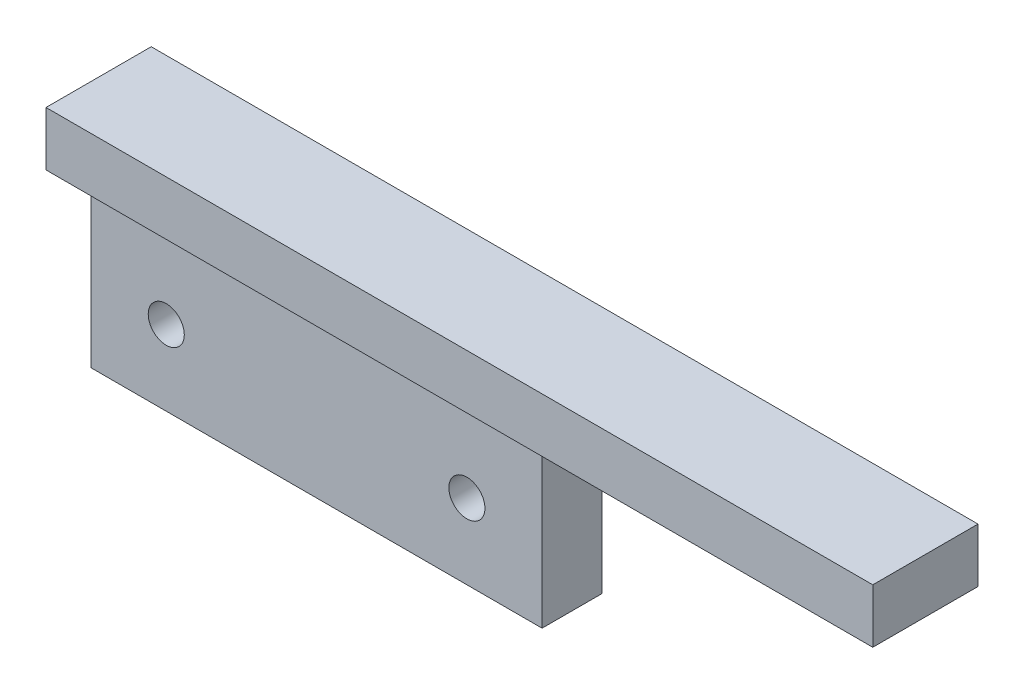
ISO-10303-21;
HEADER;
FILE_DESCRIPTION(('STEP AP214'),'2;1');
FILE_NAME('part.step','',(''),(''),'','','');
FILE_SCHEMA(('AUTOMOTIVE_DESIGN { 1 0 10303 214 1 1 1 1 }'));
ENDSEC;
DATA;
#1=APPLICATION_CONTEXT('core data for automotive mechanical design processes');
#2=APPLICATION_PROTOCOL_DEFINITION('international standard','automotive_design',2000,#1);
#3=PRODUCT_CONTEXT('',#1,'mechanical');
#4=PRODUCT('Part','Part','',(#3));
#5=PRODUCT_RELATED_PRODUCT_CATEGORY('part','',(#4));
#6=PRODUCT_DEFINITION_FORMATION('','',#4);
#7=PRODUCT_DEFINITION_CONTEXT('part definition',#1,'design');
#8=PRODUCT_DEFINITION('design','',#6,#7);
#9=PRODUCT_DEFINITION_SHAPE('','',#8);
#10=(LENGTH_UNIT() NAMED_UNIT(*) SI_UNIT(.MILLI.,.METRE.));
#11=(NAMED_UNIT(*) PLANE_ANGLE_UNIT() SI_UNIT($,.RADIAN.));
#12=(NAMED_UNIT(*) SI_UNIT($,.STERADIAN.) SOLID_ANGLE_UNIT());
#13=UNCERTAINTY_MEASURE_WITH_UNIT(LENGTH_MEASURE(1.E-05),#10,'distance_accuracy_value','');
#14=(GEOMETRIC_REPRESENTATION_CONTEXT(3) GLOBAL_UNCERTAINTY_ASSIGNED_CONTEXT((#13)) GLOBAL_UNIT_ASSIGNED_CONTEXT((#10,
#11,#12)) REPRESENTATION_CONTEXT('',''));
#15=CARTESIAN_POINT('',(0.,0.,0.));
#16=DIRECTION('',(0.,0.,1.));
#17=DIRECTION('',(1.,0.,0.));
#18=AXIS2_PLACEMENT_3D('',#15,#16,#17);
#19=CARTESIAN_POINT('',(30.,12.5,8.));
#20=DIRECTION('',(-1.,0.,0.));
#21=DIRECTION('',(0.,0.,1.));
#22=AXIS2_PLACEMENT_3D('',#19,#20,#21);
#23=PLANE('',#22);
#24=DIRECTION('',(0.,1.,0.));
#25=VECTOR('',#24,1.);
#26=CARTESIAN_POINT('',(30.,12.5,0.));
#27=LINE('',#26,#25);
#28=CARTESIAN_POINT('',(30.,-12.5,0.));
#29=VERTEX_POINT('',#28);
#30=CARTESIAN_POINT('',(30.,13.3,0.));
#31=VERTEX_POINT('',#30);
#32=EDGE_CURVE('E60',#29,#31,#27,.T.);
#33=ORIENTED_EDGE('',*,*,#32,.T.);
#34=DIRECTION('',(0.,0.,1.));
#35=VECTOR('',#34,1.);
#36=CARTESIAN_POINT('',(30.,13.3,0.));
#37=LINE('',#36,#35);
#38=CARTESIAN_POINT('',(30.,13.3,8.));
#39=VERTEX_POINT('',#38);
#40=EDGE_CURVE('E187',#31,#39,#37,.T.);
#41=ORIENTED_EDGE('',*,*,#40,.T.);
#42=DIRECTION('',(0.,1.,0.));
#43=VECTOR('',#42,1.);
#44=CARTESIAN_POINT('',(30.,12.5,8.));
#45=LINE('',#44,#43);
#46=CARTESIAN_POINT('',(30.,-12.5,8.));
#47=VERTEX_POINT('',#46);
#48=EDGE_CURVE('E88',#47,#39,#45,.T.);
#49=ORIENTED_EDGE('',*,*,#48,.F.);
#50=DIRECTION('',(0.,0.,-1.));
#51=VECTOR('',#50,1.);
#52=CARTESIAN_POINT('',(30.,-12.5,8.));
#53=LINE('',#52,#51);
#54=EDGE_CURVE('E52',#47,#29,#53,.T.);
#55=ORIENTED_EDGE('',*,*,#54,.T.);
#56=EDGE_LOOP('',(#33,#41,#49,#55));
#57=FACE_BOUND('',#56,.T.);
#58=ADVANCED_FACE('F43',(#57),#23,.F.);
#59=CARTESIAN_POINT('',(-30.,12.5,8.));
#60=DIRECTION('',(1.,0.,0.));
#61=DIRECTION('',(0.,0.,-1.));
#62=AXIS2_PLACEMENT_3D('',#59,#60,#61);
#63=PLANE('',#62);
#64=DIRECTION('',(0.,-1.,0.));
#65=VECTOR('',#64,1.);
#66=CARTESIAN_POINT('',(-30.,12.5,8.));
#67=LINE('',#66,#65);
#68=CARTESIAN_POINT('',(-30.,13.3,8.));
#69=VERTEX_POINT('',#68);
#70=CARTESIAN_POINT('',(-30.,-12.5,8.));
#71=VERTEX_POINT('',#70);
#72=EDGE_CURVE('E151',#69,#71,#67,.T.);
#73=ORIENTED_EDGE('',*,*,#72,.F.);
#74=DIRECTION('',(0.,0.,1.));
#75=VECTOR('',#74,1.);
#76=CARTESIAN_POINT('',(-30.,13.3,8.));
#77=LINE('',#76,#75);
#78=CARTESIAN_POINT('',(-30.,13.3,14.));
#79=VERTEX_POINT('',#78);
#80=EDGE_CURVE('E112',#69,#79,#77,.T.);
#81=ORIENTED_EDGE('',*,*,#80,.T.);
#82=DIRECTION('',(0.,-1.,0.));
#83=VECTOR('',#82,1.);
#84=CARTESIAN_POINT('',(-30.,12.5,14.));
#85=LINE('',#84,#83);
#86=CARTESIAN_POINT('',(-30.,20.5,14.));
#87=VERTEX_POINT('',#86);
#88=EDGE_CURVE('E143',#87,#79,#85,.T.);
#89=ORIENTED_EDGE('',*,*,#88,.F.);
#90=DIRECTION('',(0.,0.,-1.));
#91=VECTOR('',#90,1.);
#92=CARTESIAN_POINT('',(-30.,20.5,14.));
#93=LINE('',#92,#91);
#94=CARTESIAN_POINT('',(-30.,20.5,0.));
#95=VERTEX_POINT('',#94);
#96=EDGE_CURVE('E99',#87,#95,#93,.T.);
#97=ORIENTED_EDGE('',*,*,#96,.T.);
#98=DIRECTION('',(0.,-1.,0.));
#99=VECTOR('',#98,1.);
#100=CARTESIAN_POINT('',(-30.,12.5,0.));
#101=LINE('',#100,#99);
#102=CARTESIAN_POINT('',(-30.,-12.5,0.));
#103=VERTEX_POINT('',#102);
#104=EDGE_CURVE('E89',#95,#103,#101,.T.);
#105=ORIENTED_EDGE('',*,*,#104,.T.);
#106=DIRECTION('',(0.,0.,-1.));
#107=VECTOR('',#106,1.);
#108=CARTESIAN_POINT('',(-30.,-12.5,8.));
#109=LINE('',#108,#107);
#110=EDGE_CURVE('E11',#71,#103,#109,.T.);
#111=ORIENTED_EDGE('',*,*,#110,.F.);
#112=EDGE_LOOP('',(#73,#81,#89,#97,#105,#111));
#113=FACE_BOUND('',#112,.T.);
#114=ADVANCED_FACE('F160',(#113),#63,.F.);
#115=CARTESIAN_POINT('',(-30.,-12.5,8.));
#116=DIRECTION('',(0.,1.,0.));
#117=DIRECTION('',(0.,0.,1.));
#118=AXIS2_PLACEMENT_3D('',#115,#116,#117);
#119=PLANE('',#118);
#120=DIRECTION('',(1.,0.,0.));
#121=VECTOR('',#120,1.);
#122=CARTESIAN_POINT('',(-30.,-12.5,0.));
#123=LINE('',#122,#121);
#124=EDGE_CURVE('E81',#103,#29,#123,.T.);
#125=ORIENTED_EDGE('',*,*,#124,.T.);
#126=ORIENTED_EDGE('',*,*,#54,.F.);
#127=DIRECTION('',(1.,0.,0.));
#128=VECTOR('',#127,1.);
#129=CARTESIAN_POINT('',(-30.,-12.5,8.));
#130=LINE('',#129,#128);
#131=EDGE_CURVE('E69',#71,#47,#130,.T.);
#132=ORIENTED_EDGE('',*,*,#131,.F.);
#133=ORIENTED_EDGE('',*,*,#110,.T.);
#134=EDGE_LOOP('',(#125,#126,#132,#133));
#135=FACE_BOUND('',#134,.T.);
#136=ADVANCED_FACE('F82',(#135),#119,.F.);
#137=CARTESIAN_POINT('',(0.,0.,8.));
#138=DIRECTION('',(0.,0.,1.));
#139=DIRECTION('',(1.,0.,0.));
#140=AXIS2_PLACEMENT_3D('',#137,#138,#139);
#141=PLANE('',#140);
#142=CARTESIAN_POINT('',(20.,-2.5,8.));
#143=DIRECTION('',(0.,0.,1.));
#144=DIRECTION('',(1.,0.,0.));
#145=AXIS2_PLACEMENT_3D('',#142,#143,#144);
#146=CIRCLE('',#145,2.4);
#147=CARTESIAN_POINT('',(22.4,-2.5,8.));
#148=VERTEX_POINT('',#147);
#149=EDGE_CURVE('E46',#148,#148,#146,.T.);
#150=ORIENTED_EDGE('',*,*,#149,.F.);
#151=EDGE_LOOP('',(#150));
#152=FACE_BOUND('',#151,.T.);
#153=CARTESIAN_POINT('',(-20.,-2.5,8.));
#154=DIRECTION('',(0.,0.,1.));
#155=DIRECTION('',(1.,0.,0.));
#156=AXIS2_PLACEMENT_3D('',#153,#154,#155);
#157=CIRCLE('',#156,2.4);
#158=CARTESIAN_POINT('',(-17.6,-2.5,8.));
#159=VERTEX_POINT('',#158);
#160=EDGE_CURVE('E109',#159,#159,#157,.T.);
#161=ORIENTED_EDGE('',*,*,#160,.F.);
#162=EDGE_LOOP('',(#161));
#163=FACE_BOUND('',#162,.T.);
#164=ORIENTED_EDGE('',*,*,#48,.T.);
#165=DIRECTION('',(1.,0.,0.));
#166=VECTOR('',#165,1.);
#167=CARTESIAN_POINT('',(-30.,13.3,8.));
#168=LINE('',#167,#166);
#169=EDGE_CURVE('E119',#69,#39,#168,.T.);
#170=ORIENTED_EDGE('',*,*,#169,.F.);
#171=ORIENTED_EDGE('',*,*,#72,.T.);
#172=ORIENTED_EDGE('',*,*,#131,.T.);
#173=EDGE_LOOP('',(#164,#170,#171,#172));
#174=FACE_BOUND('',#173,.T.);
#175=ADVANCED_FACE('F156',(#152,#163,#174),#141,.T.);
#176=CARTESIAN_POINT('',(0.,0.,0.));
#177=DIRECTION('',(0.,0.,1.));
#178=DIRECTION('',(1.,0.,0.));
#179=AXIS2_PLACEMENT_3D('',#176,#177,#178);
#180=PLANE('',#179);
#181=CARTESIAN_POINT('',(20.,-2.5,0.));
#182=DIRECTION('',(0.,0.,-1.));
#183=DIRECTION('',(-1.,0.,0.));
#184=AXIS2_PLACEMENT_3D('',#181,#182,#183);
#185=CIRCLE('',#184,3.99999999999999);
#186=CARTESIAN_POINT('',(16.,-2.5,0.));
#187=VERTEX_POINT('',#186);
#188=EDGE_CURVE('E189',#187,#187,#185,.T.);
#189=ORIENTED_EDGE('',*,*,#188,.F.);
#190=EDGE_LOOP('',(#189));
#191=FACE_BOUND('',#190,.T.);
#192=CARTESIAN_POINT('',(-20.,-2.5,0.));
#193=DIRECTION('',(0.,0.,-1.));
#194=DIRECTION('',(-1.,0.,0.));
#195=AXIS2_PLACEMENT_3D('',#192,#193,#194);
#196=CIRCLE('',#195,3.99999999999999);
#197=CARTESIAN_POINT('',(-24.,-2.5,0.));
#198=VERTEX_POINT('',#197);
#199=EDGE_CURVE('E128',#198,#198,#196,.T.);
#200=ORIENTED_EDGE('',*,*,#199,.F.);
#201=EDGE_LOOP('',(#200));
#202=FACE_BOUND('',#201,.T.);
#203=ORIENTED_EDGE('',*,*,#32,.F.);
#204=ORIENTED_EDGE('',*,*,#124,.F.);
#205=ORIENTED_EDGE('',*,*,#104,.F.);
#206=DIRECTION('',(-1.,0.,0.));
#207=VECTOR('',#206,1.);
#208=CARTESIAN_POINT('',(-30.,20.5,0.));
#209=LINE('',#208,#207);
#210=CARTESIAN_POINT('',(80.,20.5,0.));
#211=VERTEX_POINT('',#210);
#212=EDGE_CURVE('E136',#211,#95,#209,.T.);
#213=ORIENTED_EDGE('',*,*,#212,.F.);
#214=DIRECTION('',(0.,-1.,0.));
#215=VECTOR('',#214,1.);
#216=CARTESIAN_POINT('',(80.,20.5,0.));
#217=LINE('',#216,#215);
#218=CARTESIAN_POINT('',(80.,13.3,0.));
#219=VERTEX_POINT('',#218);
#220=EDGE_CURVE('E196',#211,#219,#217,.T.);
#221=ORIENTED_EDGE('',*,*,#220,.T.);
#222=DIRECTION('',(-1.,0.,0.));
#223=VECTOR('',#222,1.);
#224=CARTESIAN_POINT('',(80.,13.3,0.));
#225=LINE('',#224,#223);
#226=EDGE_CURVE('E96',#219,#31,#225,.T.);
#227=ORIENTED_EDGE('',*,*,#226,.T.);
#228=EDGE_LOOP('',(#203,#204,#205,#213,#221,#227));
#229=FACE_BOUND('',#228,.T.);
#230=ADVANCED_FACE('F93',(#191,#202,#229),#180,.F.);
#231=CARTESIAN_POINT('',(-30.,20.5,14.));
#232=DIRECTION('',(0.,-1.,0.));
#233=DIRECTION('',(0.,0.,-1.));
#234=AXIS2_PLACEMENT_3D('',#231,#232,#233);
#235=PLANE('',#234);
#236=DIRECTION('',(-1.,0.,0.));
#237=VECTOR('',#236,1.);
#238=CARTESIAN_POINT('',(-30.,20.5,14.));
#239=LINE('',#238,#237);
#240=CARTESIAN_POINT('',(80.,20.5,14.));
#241=VERTEX_POINT('',#240);
#242=EDGE_CURVE('E105',#241,#87,#239,.T.);
#243=ORIENTED_EDGE('',*,*,#242,.F.);
#244=DIRECTION('',(0.,0.,-1.));
#245=VECTOR('',#244,1.);
#246=CARTESIAN_POINT('',(80.,20.5,0.));
#247=LINE('',#246,#245);
#248=EDGE_CURVE('E190',#241,#211,#247,.T.);
#249=ORIENTED_EDGE('',*,*,#248,.T.);
#250=ORIENTED_EDGE('',*,*,#212,.T.);
#251=ORIENTED_EDGE('',*,*,#96,.F.);
#252=EDGE_LOOP('',(#243,#249,#250,#251));
#253=FACE_BOUND('',#252,.T.);
#254=ADVANCED_FACE('F239',(#253),#235,.F.);
#255=CARTESIAN_POINT('',(0.,0.,14.));
#256=DIRECTION('',(0.,0.,-1.));
#257=DIRECTION('',(-1.,0.,0.));
#258=AXIS2_PLACEMENT_3D('',#255,#256,#257);
#259=PLANE('',#258);
#260=ORIENTED_EDGE('',*,*,#88,.T.);
#261=DIRECTION('',(1.,0.,0.));
#262=VECTOR('',#261,1.);
#263=CARTESIAN_POINT('',(-30.,13.3,14.));
#264=LINE('',#263,#262);
#265=CARTESIAN_POINT('',(80.,13.3,14.));
#266=VERTEX_POINT('',#265);
#267=EDGE_CURVE('E132',#79,#266,#264,.T.);
#268=ORIENTED_EDGE('',*,*,#267,.T.);
#269=DIRECTION('',(0.,1.,0.));
#270=VECTOR('',#269,1.);
#271=CARTESIAN_POINT('',(80.,20.5,14.));
#272=LINE('',#271,#270);
#273=EDGE_CURVE('E199',#266,#241,#272,.T.);
#274=ORIENTED_EDGE('',*,*,#273,.T.);
#275=ORIENTED_EDGE('',*,*,#242,.T.);
#276=EDGE_LOOP('',(#260,#268,#274,#275));
#277=FACE_BOUND('',#276,.T.);
#278=ADVANCED_FACE('F311',(#277),#259,.F.);
#279=CARTESIAN_POINT('',(-30.,13.3,8.));
#280=DIRECTION('',(0.,1.,0.));
#281=DIRECTION('',(-1.,0.,0.));
#282=AXIS2_PLACEMENT_3D('',#279,#280,#281);
#283=PLANE('',#282);
#284=ORIENTED_EDGE('',*,*,#267,.F.);
#285=ORIENTED_EDGE('',*,*,#80,.F.);
#286=ORIENTED_EDGE('',*,*,#169,.T.);
#287=ORIENTED_EDGE('',*,*,#40,.F.);
#288=ORIENTED_EDGE('',*,*,#226,.F.);
#289=DIRECTION('',(0.,0.,1.));
#290=VECTOR('',#289,1.);
#291=CARTESIAN_POINT('',(80.,13.3,0.));
#292=LINE('',#291,#290);
#293=EDGE_CURVE('E186',#219,#266,#292,.T.);
#294=ORIENTED_EDGE('',*,*,#293,.T.);
#295=EDGE_LOOP('',(#284,#285,#286,#287,#288,#294));
#296=FACE_BOUND('',#295,.T.);
#297=ADVANCED_FACE('F185',(#296),#283,.F.);
#298=CARTESIAN_POINT('',(-20.,-2.5,0.));
#299=DIRECTION('',(0.,0.,-1.));
#300=DIRECTION('',(-1.,0.,0.));
#301=AXIS2_PLACEMENT_3D('',#298,#299,#300);
#302=CYLINDRICAL_SURFACE('',#301,2.4);
#303=ORIENTED_EDGE('',*,*,#160,.T.);
#304=EDGE_LOOP('',(#303));
#305=FACE_BOUND('',#304,.T.);
#306=CARTESIAN_POINT('',(-20.,-2.5,4.));
#307=DIRECTION('',(0.,0.,-1.));
#308=DIRECTION('',(-1.,0.,0.));
#309=AXIS2_PLACEMENT_3D('',#306,#307,#308);
#310=CIRCLE('',#309,2.4);
#311=CARTESIAN_POINT('',(-22.4,-2.5,4.));
#312=VERTEX_POINT('',#311);
#313=EDGE_CURVE('E113',#312,#312,#310,.T.);
#314=ORIENTED_EDGE('',*,*,#313,.T.);
#315=EDGE_LOOP('',(#314));
#316=FACE_BOUND('',#315,.T.);
#317=ADVANCED_FACE('F329',(#305,#316),#302,.F.);
#318=CARTESIAN_POINT('',(-17.6,-2.5,4.));
#319=DIRECTION('',(0.,0.,1.));
#320=DIRECTION('',(1.,0.,0.));
#321=AXIS2_PLACEMENT_3D('',#318,#319,#320);
#322=PLANE('',#321);
#323=ORIENTED_EDGE('',*,*,#313,.F.);
#324=EDGE_LOOP('',(#323));
#325=FACE_BOUND('',#324,.T.);
#326=CARTESIAN_POINT('',(-20.,-2.5,4.));
#327=DIRECTION('',(0.,0.,-1.));
#328=DIRECTION('',(-1.,0.,0.));
#329=AXIS2_PLACEMENT_3D('',#326,#327,#328);
#330=CIRCLE('',#329,4.);
#331=CARTESIAN_POINT('',(-24.,-2.5,4.));
#332=VERTEX_POINT('',#331);
#333=EDGE_CURVE('E122',#332,#332,#330,.T.);
#334=ORIENTED_EDGE('',*,*,#333,.T.);
#335=EDGE_LOOP('',(#334));
#336=FACE_BOUND('',#335,.T.);
#337=ADVANCED_FACE('F364',(#325,#336),#322,.F.);
#338=CARTESIAN_POINT('',(-20.,-2.5,0.));
#339=DIRECTION('',(0.,0.,-1.));
#340=DIRECTION('',(-1.,0.,0.));
#341=AXIS2_PLACEMENT_3D('',#338,#339,#340);
#342=CYLINDRICAL_SURFACE('',#341,3.99999999999999);
#343=ORIENTED_EDGE('',*,*,#333,.F.);
#344=EDGE_LOOP('',(#343));
#345=FACE_BOUND('',#344,.T.);
#346=ORIENTED_EDGE('',*,*,#199,.T.);
#347=EDGE_LOOP('',(#346));
#348=FACE_BOUND('',#347,.T.);
#349=ADVANCED_FACE('F357',(#345,#348),#342,.F.);
#350=CARTESIAN_POINT('',(20.,-2.5,0.));
#351=DIRECTION('',(0.,0.,-1.));
#352=DIRECTION('',(-1.,0.,0.));
#353=AXIS2_PLACEMENT_3D('',#350,#351,#352);
#354=CYLINDRICAL_SURFACE('',#353,2.4);
#355=ORIENTED_EDGE('',*,*,#149,.T.);
#356=EDGE_LOOP('',(#355));
#357=FACE_BOUND('',#356,.T.);
#358=CARTESIAN_POINT('',(20.,-2.5,4.));
#359=DIRECTION('',(0.,0.,-1.));
#360=DIRECTION('',(-1.,0.,0.));
#361=AXIS2_PLACEMENT_3D('',#358,#359,#360);
#362=CIRCLE('',#361,2.4);
#363=CARTESIAN_POINT('',(17.6,-2.5,4.));
#364=VERTEX_POINT('',#363);
#365=EDGE_CURVE('E218',#364,#364,#362,.T.);
#366=ORIENTED_EDGE('',*,*,#365,.T.);
#367=EDGE_LOOP('',(#366));
#368=FACE_BOUND('',#367,.T.);
#369=ADVANCED_FACE('F229',(#357,#368),#354,.F.);
#370=CARTESIAN_POINT('',(22.4,-2.5,4.));
#371=DIRECTION('',(0.,0.,1.));
#372=DIRECTION('',(1.,0.,0.));
#373=AXIS2_PLACEMENT_3D('',#370,#371,#372);
#374=PLANE('',#373);
#375=ORIENTED_EDGE('',*,*,#365,.F.);
#376=EDGE_LOOP('',(#375));
#377=FACE_BOUND('',#376,.T.);
#378=CARTESIAN_POINT('',(20.,-2.5,4.));
#379=DIRECTION('',(0.,0.,-1.));
#380=DIRECTION('',(-1.,0.,0.));
#381=AXIS2_PLACEMENT_3D('',#378,#379,#380);
#382=CIRCLE('',#381,4.);
#383=CARTESIAN_POINT('',(16.,-2.5,4.));
#384=VERTEX_POINT('',#383);
#385=EDGE_CURVE('E214',#384,#384,#382,.T.);
#386=ORIENTED_EDGE('',*,*,#385,.T.);
#387=EDGE_LOOP('',(#386));
#388=FACE_BOUND('',#387,.T.);
#389=ADVANCED_FACE('F345',(#377,#388),#374,.F.);
#390=CARTESIAN_POINT('',(20.,-2.5,0.));
#391=DIRECTION('',(0.,0.,-1.));
#392=DIRECTION('',(-1.,0.,0.));
#393=AXIS2_PLACEMENT_3D('',#390,#391,#392);
#394=CYLINDRICAL_SURFACE('',#393,3.99999999999999);
#395=ORIENTED_EDGE('',*,*,#385,.F.);
#396=EDGE_LOOP('',(#395));
#397=FACE_BOUND('',#396,.T.);
#398=ORIENTED_EDGE('',*,*,#188,.T.);
#399=EDGE_LOOP('',(#398));
#400=FACE_BOUND('',#399,.T.);
#401=ADVANCED_FACE('F297',(#397,#400),#394,.F.);
#402=CARTESIAN_POINT('',(80.,0.,0.));
#403=DIRECTION('',(-1.,0.,0.));
#404=DIRECTION('',(0.,0.,1.));
#405=AXIS2_PLACEMENT_3D('',#402,#403,#404);
#406=PLANE('',#405);
#407=ORIENTED_EDGE('',*,*,#220,.F.);
#408=ORIENTED_EDGE('',*,*,#248,.F.);
#409=ORIENTED_EDGE('',*,*,#273,.F.);
#410=ORIENTED_EDGE('',*,*,#293,.F.);
#411=EDGE_LOOP('',(#407,#408,#409,#410));
#412=FACE_BOUND('',#411,.T.);
#413=ADVANCED_FACE('F194',(#412),#406,.F.);
#414=CLOSED_SHELL('',(#58,#114,#136,#175,#230,#254,#278,#297,#317,#337,#349,#369,#389,#401,#413));
#415=MANIFOLD_SOLID_BREP('B2',#414);
#416=ADVANCED_BREP_SHAPE_REPRESENTATION('',(#18,#415),#14);
#417=SHAPE_DEFINITION_REPRESENTATION(#9,#416);
ENDSEC;
END-ISO-10303-21;
